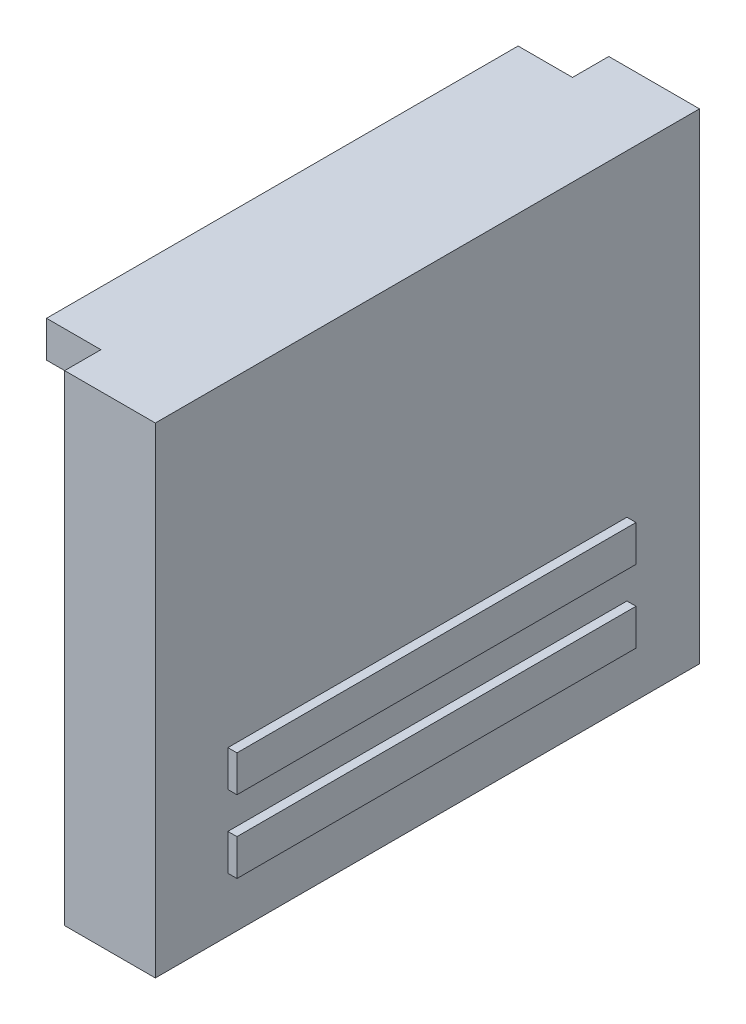
ISO-10303-21;
HEADER;
FILE_DESCRIPTION(('STEP AP214'),'2;1');
FILE_NAME('part.step','',(''),(''),'','','');
FILE_SCHEMA(('AUTOMOTIVE_DESIGN { 1 0 10303 214 1 1 1 1 }'));
ENDSEC;
DATA;
#1=APPLICATION_CONTEXT('core data for automotive mechanical design processes');
#2=APPLICATION_PROTOCOL_DEFINITION('international standard','automotive_design',2000,#1);
#3=PRODUCT_CONTEXT('',#1,'mechanical');
#4=PRODUCT('Part','Part','',(#3));
#5=PRODUCT_RELATED_PRODUCT_CATEGORY('part','',(#4));
#6=PRODUCT_DEFINITION_FORMATION('','',#4);
#7=PRODUCT_DEFINITION_CONTEXT('part definition',#1,'design');
#8=PRODUCT_DEFINITION('design','',#6,#7);
#9=PRODUCT_DEFINITION_SHAPE('','',#8);
#10=(LENGTH_UNIT() NAMED_UNIT(*) SI_UNIT(.MILLI.,.METRE.));
#11=(NAMED_UNIT(*) PLANE_ANGLE_UNIT() SI_UNIT($,.RADIAN.));
#12=(NAMED_UNIT(*) SI_UNIT($,.STERADIAN.) SOLID_ANGLE_UNIT());
#13=UNCERTAINTY_MEASURE_WITH_UNIT(LENGTH_MEASURE(1.E-05),#10,'distance_accuracy_value','');
#14=(GEOMETRIC_REPRESENTATION_CONTEXT(3) GLOBAL_UNCERTAINTY_ASSIGNED_CONTEXT((#13)) GLOBAL_UNIT_ASSIGNED_CONTEXT((#10,
#11,#12)) REPRESENTATION_CONTEXT('',''));
#15=CARTESIAN_POINT('',(0.,0.,0.));
#16=DIRECTION('',(0.,0.,1.));
#17=DIRECTION('',(1.,0.,0.));
#18=AXIS2_PLACEMENT_3D('',#15,#16,#17);
#19=CARTESIAN_POINT('',(181.650792305083,0.,0.));
#20=DIRECTION('',(1.,0.,0.));
#21=DIRECTION('',(0.,0.,-1.));
#22=AXIS2_PLACEMENT_3D('',#19,#20,#21);
#23=PLANE('',#22);
#24=DIRECTION('',(0.,0.,-1.));
#25=VECTOR('',#24,1.);
#26=CARTESIAN_POINT('',(181.650792305083,37.,164.));
#27=LINE('',#26,#25);
#28=CARTESIAN_POINT('',(181.650792305083,37.,164.));
#29=VERTEX_POINT('',#28);
#30=CARTESIAN_POINT('',(181.650792305083,37.,134.));
#31=VERTEX_POINT('',#30);
#32=EDGE_CURVE('E230',#29,#31,#27,.T.);
#33=ORIENTED_EDGE('',*,*,#32,.T.);
#34=DIRECTION('',(0.,1.,0.));
#35=VECTOR('',#34,1.);
#36=CARTESIAN_POINT('',(181.650792305083,37.,134.));
#37=LINE('',#36,#35);
#38=CARTESIAN_POINT('',(181.650792305083,63.5,134.));
#39=VERTEX_POINT('',#38);
#40=EDGE_CURVE('E233',#31,#39,#37,.T.);
#41=ORIENTED_EDGE('',*,*,#40,.T.);
#42=DIRECTION('',(0.,0.,1.));
#43=VECTOR('',#42,1.);
#44=CARTESIAN_POINT('',(181.650792305083,63.5,134.));
#45=LINE('',#44,#43);
#46=CARTESIAN_POINT('',(181.650792305083,63.5,164.));
#47=VERTEX_POINT('',#46);
#48=EDGE_CURVE('E236',#39,#47,#45,.T.);
#49=ORIENTED_EDGE('',*,*,#48,.T.);
#50=DIRECTION('',(0.,-1.,0.));
#51=VECTOR('',#50,1.);
#52=CARTESIAN_POINT('',(181.650792305083,63.5,164.));
#53=LINE('',#52,#51);
#54=EDGE_CURVE('E238',#47,#29,#53,.T.);
#55=ORIENTED_EDGE('',*,*,#54,.T.);
#56=EDGE_LOOP('',(#33,#41,#49,#55));
#57=FACE_BOUND('',#56,.T.);
#58=DIRECTION('',(0.,-1.,0.));
#59=VECTOR('',#58,1.);
#60=CARTESIAN_POINT('',(181.650792305083,0.,138.));
#61=LINE('',#60,#59);
#62=CARTESIAN_POINT('',(181.650792305083,42.,138.));
#63=VERTEX_POINT('',#62);
#64=CARTESIAN_POINT('',(181.650792305083,40.,138.));
#65=VERTEX_POINT('',#64);
#66=EDGE_CURVE('E266',#63,#65,#61,.T.);
#67=ORIENTED_EDGE('',*,*,#66,.T.);
#68=DIRECTION('',(0.,0.,1.));
#69=VECTOR('',#68,1.);
#70=CARTESIAN_POINT('',(181.650792305083,40.,0.));
#71=LINE('',#70,#69);
#72=CARTESIAN_POINT('',(181.650792305083,40.,160.));
#73=VERTEX_POINT('',#72);
#74=EDGE_CURVE('E269',#65,#73,#71,.T.);
#75=ORIENTED_EDGE('',*,*,#74,.T.);
#76=DIRECTION('',(0.,1.,0.));
#77=VECTOR('',#76,1.);
#78=CARTESIAN_POINT('',(181.650792305083,0.,160.));
#79=LINE('',#78,#77);
#80=CARTESIAN_POINT('',(181.650792305083,42.,160.));
#81=VERTEX_POINT('',#80);
#82=EDGE_CURVE('E260',#73,#81,#79,.T.);
#83=ORIENTED_EDGE('',*,*,#82,.T.);
#84=DIRECTION('',(0.,0.,-1.));
#85=VECTOR('',#84,1.);
#86=CARTESIAN_POINT('',(181.650792305083,42.,0.));
#87=LINE('',#86,#85);
#88=EDGE_CURVE('E263',#81,#63,#87,.T.);
#89=ORIENTED_EDGE('',*,*,#88,.T.);
#90=EDGE_LOOP('',(#67,#75,#83,#89));
#91=FACE_BOUND('',#90,.T.);
#92=DIRECTION('',(0.,-1.,0.));
#93=VECTOR('',#92,1.);
#94=CARTESIAN_POINT('',(181.650792305083,0.,138.));
#95=LINE('',#94,#93);
#96=CARTESIAN_POINT('',(181.650792305083,46.,138.));
#97=VERTEX_POINT('',#96);
#98=CARTESIAN_POINT('',(181.650792305083,44.,138.));
#99=VERTEX_POINT('',#98);
#100=EDGE_CURVE('E278',#97,#99,#95,.T.);
#101=ORIENTED_EDGE('',*,*,#100,.T.);
#102=DIRECTION('',(0.,0.,1.));
#103=VECTOR('',#102,1.);
#104=CARTESIAN_POINT('',(181.650792305083,44.,0.));
#105=LINE('',#104,#103);
#106=CARTESIAN_POINT('',(181.650792305083,44.,160.));
#107=VERTEX_POINT('',#106);
#108=EDGE_CURVE('E45',#99,#107,#105,.T.);
#109=ORIENTED_EDGE('',*,*,#108,.T.);
#110=DIRECTION('',(0.,1.,0.));
#111=VECTOR('',#110,1.);
#112=CARTESIAN_POINT('',(181.650792305083,0.,160.));
#113=LINE('',#112,#111);
#114=CARTESIAN_POINT('',(181.650792305083,46.,160.));
#115=VERTEX_POINT('',#114);
#116=EDGE_CURVE('E272',#107,#115,#113,.T.);
#117=ORIENTED_EDGE('',*,*,#116,.T.);
#118=DIRECTION('',(0.,0.,-1.));
#119=VECTOR('',#118,1.);
#120=CARTESIAN_POINT('',(181.650792305083,46.,0.));
#121=LINE('',#120,#119);
#122=EDGE_CURVE('E275',#115,#97,#121,.T.);
#123=ORIENTED_EDGE('',*,*,#122,.T.);
#124=EDGE_LOOP('',(#101,#109,#117,#123));
#125=FACE_BOUND('',#124,.T.);
#126=ADVANCED_FACE('F37',(#57,#91,#125),#23,.T.);
#127=CARTESIAN_POINT('',(181.650792305083,37.,164.));
#128=DIRECTION('',(0.,1.,0.));
#129=DIRECTION('',(0.,0.,1.));
#130=AXIS2_PLACEMENT_3D('',#127,#128,#129);
#131=PLANE('',#130);
#132=DIRECTION('',(0.,0.,-1.));
#133=VECTOR('',#132,1.);
#134=CARTESIAN_POINT('',(176.650792305083,37.,164.));
#135=LINE('',#134,#133);
#136=CARTESIAN_POINT('',(176.650792305083,37.,164.));
#137=VERTEX_POINT('',#136);
#138=CARTESIAN_POINT('',(176.650792305083,37.,134.));
#139=VERTEX_POINT('',#138);
#140=EDGE_CURVE('E229',#137,#139,#135,.T.);
#141=ORIENTED_EDGE('',*,*,#140,.T.);
#142=DIRECTION('',(-1.,0.,0.));
#143=VECTOR('',#142,1.);
#144=CARTESIAN_POINT('',(181.650792305083,37.,134.));
#145=LINE('',#144,#143);
#146=EDGE_CURVE('E257',#31,#139,#145,.T.);
#147=ORIENTED_EDGE('',*,*,#146,.F.);
#148=ORIENTED_EDGE('',*,*,#32,.F.);
#149=DIRECTION('',(-1.,0.,0.));
#150=VECTOR('',#149,1.);
#151=CARTESIAN_POINT('',(181.650792305083,37.,164.));
#152=LINE('',#151,#150);
#153=EDGE_CURVE('E240',#29,#137,#152,.T.);
#154=ORIENTED_EDGE('',*,*,#153,.T.);
#155=EDGE_LOOP('',(#141,#147,#148,#154));
#156=FACE_BOUND('',#155,.T.);
#157=ADVANCED_FACE('F39',(#156),#131,.F.);
#158=CARTESIAN_POINT('',(181.650792305083,37.,134.));
#159=DIRECTION('',(0.,0.,1.));
#160=DIRECTION('',(1.,0.,0.));
#161=AXIS2_PLACEMENT_3D('',#158,#159,#160);
#162=PLANE('',#161);
#163=DIRECTION('',(0.,1.,0.));
#164=VECTOR('',#163,1.);
#165=CARTESIAN_POINT('',(176.650792305083,37.,134.));
#166=LINE('',#165,#164);
#167=CARTESIAN_POINT('',(176.650792305083,63.5,134.));
#168=VERTEX_POINT('',#167);
#169=EDGE_CURVE('E243',#139,#168,#166,.T.);
#170=ORIENTED_EDGE('',*,*,#169,.T.);
#171=DIRECTION('',(-1.,0.,0.));
#172=VECTOR('',#171,1.);
#173=CARTESIAN_POINT('',(181.650792305083,63.5,134.));
#174=LINE('',#173,#172);
#175=EDGE_CURVE('E254',#39,#168,#174,.T.);
#176=ORIENTED_EDGE('',*,*,#175,.F.);
#177=ORIENTED_EDGE('',*,*,#40,.F.);
#178=ORIENTED_EDGE('',*,*,#146,.T.);
#179=EDGE_LOOP('',(#170,#176,#177,#178));
#180=FACE_BOUND('',#179,.T.);
#181=ADVANCED_FACE('F310',(#180),#162,.F.);
#182=CARTESIAN_POINT('',(181.650792305083,63.5,134.));
#183=DIRECTION('',(0.,-1.,0.));
#184=DIRECTION('',(0.,0.,-1.));
#185=AXIS2_PLACEMENT_3D('',#182,#183,#184);
#186=PLANE('',#185);
#187=DIRECTION('',(0.,0.,1.));
#188=VECTOR('',#187,1.);
#189=CARTESIAN_POINT('',(176.650792305083,63.5,134.));
#190=LINE('',#189,#188);
#191=CARTESIAN_POINT('',(176.650792305083,63.5,136.));
#192=VERTEX_POINT('',#191);
#193=EDGE_CURVE('E246',#168,#192,#190,.T.);
#194=ORIENTED_EDGE('',*,*,#193,.T.);
#195=DIRECTION('',(-1.,0.,0.));
#196=VECTOR('',#195,1.);
#197=CARTESIAN_POINT('',(176.650792305083,63.5,136.));
#198=LINE('',#197,#196);
#199=CARTESIAN_POINT('',(173.650792305083,63.5,136.));
#200=VERTEX_POINT('',#199);
#201=EDGE_CURVE('E158',#192,#200,#198,.T.);
#202=ORIENTED_EDGE('',*,*,#201,.T.);
#203=DIRECTION('',(0.,0.,1.));
#204=VECTOR('',#203,1.);
#205=CARTESIAN_POINT('',(173.650792305083,63.5,136.));
#206=LINE('',#205,#204);
#207=CARTESIAN_POINT('',(173.650792305083,63.5,162.));
#208=VERTEX_POINT('',#207);
#209=EDGE_CURVE('E175',#200,#208,#206,.T.);
#210=ORIENTED_EDGE('',*,*,#209,.T.);
#211=DIRECTION('',(-1.,0.,0.));
#212=VECTOR('',#211,1.);
#213=CARTESIAN_POINT('',(176.650792305083,63.5,162.));
#214=LINE('',#213,#212);
#215=CARTESIAN_POINT('',(176.650792305083,63.5,162.));
#216=VERTEX_POINT('',#215);
#217=EDGE_CURVE('E187',#216,#208,#214,.T.);
#218=ORIENTED_EDGE('',*,*,#217,.F.);
#219=CARTESIAN_POINT('',(176.650792305083,63.5,164.));
#220=VERTEX_POINT('',#219);
#221=EDGE_CURVE('E245',#216,#220,#190,.T.);
#222=ORIENTED_EDGE('',*,*,#221,.T.);
#223=DIRECTION('',(-1.,0.,0.));
#224=VECTOR('',#223,1.);
#225=CARTESIAN_POINT('',(181.650792305083,63.5,164.));
#226=LINE('',#225,#224);
#227=EDGE_CURVE('E251',#47,#220,#226,.T.);
#228=ORIENTED_EDGE('',*,*,#227,.F.);
#229=ORIENTED_EDGE('',*,*,#48,.F.);
#230=ORIENTED_EDGE('',*,*,#175,.T.);
#231=EDGE_LOOP('',(#194,#202,#210,#218,#222,#228,#229,#230));
#232=FACE_BOUND('',#231,.T.);
#233=ADVANCED_FACE('F323',(#232),#186,.F.);
#234=CARTESIAN_POINT('',(181.650792305083,63.5,164.));
#235=DIRECTION('',(0.,0.,-1.));
#236=DIRECTION('',(-1.,0.,0.));
#237=AXIS2_PLACEMENT_3D('',#234,#235,#236);
#238=PLANE('',#237);
#239=DIRECTION('',(0.,-1.,0.));
#240=VECTOR('',#239,1.);
#241=CARTESIAN_POINT('',(176.650792305083,63.5,164.));
#242=LINE('',#241,#240);
#243=EDGE_CURVE('E234',#220,#137,#242,.T.);
#244=ORIENTED_EDGE('',*,*,#243,.T.);
#245=ORIENTED_EDGE('',*,*,#153,.F.);
#246=ORIENTED_EDGE('',*,*,#54,.F.);
#247=ORIENTED_EDGE('',*,*,#227,.T.);
#248=EDGE_LOOP('',(#244,#245,#246,#247));
#249=FACE_BOUND('',#248,.T.);
#250=ADVANCED_FACE('F319',(#249),#238,.F.);
#251=CARTESIAN_POINT('',(176.650792305083,0.,0.));
#252=DIRECTION('',(1.,0.,0.));
#253=DIRECTION('',(0.,0.,-1.));
#254=AXIS2_PLACEMENT_3D('',#251,#252,#253);
#255=PLANE('',#254);
#256=CARTESIAN_POINT('',(176.650792305083,43.,149.));
#257=DIRECTION('',(1.,0.,0.));
#258=DIRECTION('',(0.,0.,-1.));
#259=AXIS2_PLACEMENT_3D('',#256,#257,#258);
#260=CIRCLE('',#259,2.);
#261=CARTESIAN_POINT('',(176.650792305083,43.,147.));
#262=VERTEX_POINT('',#261);
#263=EDGE_CURVE('E11',#262,#262,#260,.F.);
#264=ORIENTED_EDGE('',*,*,#263,.F.);
#265=EDGE_LOOP('',(#264));
#266=FACE_BOUND('',#265,.T.);
#267=DIRECTION('',(0.,0.,-1.));
#268=VECTOR('',#267,1.);
#269=CARTESIAN_POINT('',(176.650792305083,61.5,162.));
#270=LINE('',#269,#268);
#271=CARTESIAN_POINT('',(176.650792305083,61.5,162.));
#272=VERTEX_POINT('',#271);
#273=CARTESIAN_POINT('',(176.650792305083,61.5,136.));
#274=VERTEX_POINT('',#273);
#275=EDGE_CURVE('E52',#272,#274,#270,.T.);
#276=ORIENTED_EDGE('',*,*,#275,.T.);
#277=DIRECTION('',(0.,1.,0.));
#278=VECTOR('',#277,1.);
#279=CARTESIAN_POINT('',(176.650792305083,61.5,136.));
#280=LINE('',#279,#278);
#281=EDGE_CURVE('E153',#274,#192,#280,.T.);
#282=ORIENTED_EDGE('',*,*,#281,.T.);
#283=ORIENTED_EDGE('',*,*,#193,.F.);
#284=ORIENTED_EDGE('',*,*,#169,.F.);
#285=ORIENTED_EDGE('',*,*,#140,.F.);
#286=ORIENTED_EDGE('',*,*,#243,.F.);
#287=ORIENTED_EDGE('',*,*,#221,.F.);
#288=DIRECTION('',(0.,-1.,0.));
#289=VECTOR('',#288,1.);
#290=CARTESIAN_POINT('',(176.650792305083,63.5,162.));
#291=LINE('',#290,#289);
#292=EDGE_CURVE('E162',#216,#272,#291,.T.);
#293=ORIENTED_EDGE('',*,*,#292,.T.);
#294=EDGE_LOOP('',(#276,#282,#283,#284,#285,#286,#287,#293));
#295=FACE_BOUND('',#294,.T.);
#296=ADVANCED_FACE('F170',(#266,#295),#255,.F.);
#297=CARTESIAN_POINT('',(182.150792305083,40.,160.));
#298=DIRECTION('',(0.,1.,0.));
#299=DIRECTION('',(0.,0.,1.));
#300=AXIS2_PLACEMENT_3D('',#297,#298,#299);
#301=PLANE('',#300);
#302=ORIENTED_EDGE('',*,*,#74,.F.);
#303=DIRECTION('',(-1.,0.,0.));
#304=VECTOR('',#303,1.);
#305=CARTESIAN_POINT('',(182.150792305083,40.,138.));
#306=LINE('',#305,#304);
#307=CARTESIAN_POINT('',(182.150792305083,40.,138.));
#308=VERTEX_POINT('',#307);
#309=EDGE_CURVE('E226',#308,#65,#306,.T.);
#310=ORIENTED_EDGE('',*,*,#309,.F.);
#311=DIRECTION('',(0.,0.,-1.));
#312=VECTOR('',#311,1.);
#313=CARTESIAN_POINT('',(182.150792305083,40.,160.));
#314=LINE('',#313,#312);
#315=CARTESIAN_POINT('',(182.150792305083,40.,160.));
#316=VERTEX_POINT('',#315);
#317=EDGE_CURVE('E209',#316,#308,#314,.T.);
#318=ORIENTED_EDGE('',*,*,#317,.F.);
#319=DIRECTION('',(-1.,0.,0.));
#320=VECTOR('',#319,1.);
#321=CARTESIAN_POINT('',(182.150792305083,40.,160.));
#322=LINE('',#321,#320);
#323=EDGE_CURVE('E218',#316,#73,#322,.T.);
#324=ORIENTED_EDGE('',*,*,#323,.T.);
#325=EDGE_LOOP('',(#302,#310,#318,#324));
#326=FACE_BOUND('',#325,.T.);
#327=ADVANCED_FACE('F315',(#326),#301,.F.);
#328=CARTESIAN_POINT('',(182.150792305083,40.,138.));
#329=DIRECTION('',(0.,0.,1.));
#330=DIRECTION('',(1.,0.,0.));
#331=AXIS2_PLACEMENT_3D('',#328,#329,#330);
#332=PLANE('',#331);
#333=ORIENTED_EDGE('',*,*,#66,.F.);
#334=DIRECTION('',(-1.,0.,0.));
#335=VECTOR('',#334,1.);
#336=CARTESIAN_POINT('',(182.150792305083,42.,138.));
#337=LINE('',#336,#335);
#338=CARTESIAN_POINT('',(182.150792305083,42.,138.));
#339=VERTEX_POINT('',#338);
#340=EDGE_CURVE('E223',#339,#63,#337,.T.);
#341=ORIENTED_EDGE('',*,*,#340,.F.);
#342=DIRECTION('',(0.,1.,0.));
#343=VECTOR('',#342,1.);
#344=CARTESIAN_POINT('',(182.150792305083,40.,138.));
#345=LINE('',#344,#343);
#346=EDGE_CURVE('E212',#308,#339,#345,.T.);
#347=ORIENTED_EDGE('',*,*,#346,.F.);
#348=ORIENTED_EDGE('',*,*,#309,.T.);
#349=EDGE_LOOP('',(#333,#341,#347,#348));
#350=FACE_BOUND('',#349,.T.);
#351=ADVANCED_FACE('F494',(#350),#332,.F.);
#352=CARTESIAN_POINT('',(182.150792305083,42.,138.));
#353=DIRECTION('',(0.,-1.,0.));
#354=DIRECTION('',(0.,0.,-1.));
#355=AXIS2_PLACEMENT_3D('',#352,#353,#354);
#356=PLANE('',#355);
#357=ORIENTED_EDGE('',*,*,#88,.F.);
#358=DIRECTION('',(-1.,0.,0.));
#359=VECTOR('',#358,1.);
#360=CARTESIAN_POINT('',(182.150792305083,42.,160.));
#361=LINE('',#360,#359);
#362=CARTESIAN_POINT('',(182.150792305083,42.,160.));
#363=VERTEX_POINT('',#362);
#364=EDGE_CURVE('E221',#363,#81,#361,.T.);
#365=ORIENTED_EDGE('',*,*,#364,.F.);
#366=DIRECTION('',(0.,0.,1.));
#367=VECTOR('',#366,1.);
#368=CARTESIAN_POINT('',(182.150792305083,42.,138.));
#369=LINE('',#368,#367);
#370=EDGE_CURVE('E214',#339,#363,#369,.T.);
#371=ORIENTED_EDGE('',*,*,#370,.F.);
#372=ORIENTED_EDGE('',*,*,#340,.T.);
#373=EDGE_LOOP('',(#357,#365,#371,#372));
#374=FACE_BOUND('',#373,.T.);
#375=ADVANCED_FACE('F484',(#374),#356,.F.);
#376=CARTESIAN_POINT('',(182.150792305083,42.,160.));
#377=DIRECTION('',(0.,0.,-1.));
#378=DIRECTION('',(-1.,0.,0.));
#379=AXIS2_PLACEMENT_3D('',#376,#377,#378);
#380=PLANE('',#379);
#381=ORIENTED_EDGE('',*,*,#82,.F.);
#382=ORIENTED_EDGE('',*,*,#323,.F.);
#383=DIRECTION('',(0.,-1.,0.));
#384=VECTOR('',#383,1.);
#385=CARTESIAN_POINT('',(182.150792305083,42.,160.));
#386=LINE('',#385,#384);
#387=EDGE_CURVE('E216',#363,#316,#386,.T.);
#388=ORIENTED_EDGE('',*,*,#387,.F.);
#389=ORIENTED_EDGE('',*,*,#364,.T.);
#390=EDGE_LOOP('',(#381,#382,#388,#389));
#391=FACE_BOUND('',#390,.T.);
#392=ADVANCED_FACE('F474',(#391),#380,.F.);
#393=CARTESIAN_POINT('',(182.150792305083,0.,0.));
#394=DIRECTION('',(1.,0.,0.));
#395=DIRECTION('',(0.,0.,-1.));
#396=AXIS2_PLACEMENT_3D('',#393,#394,#395);
#397=PLANE('',#396);
#398=ORIENTED_EDGE('',*,*,#317,.T.);
#399=ORIENTED_EDGE('',*,*,#346,.T.);
#400=ORIENTED_EDGE('',*,*,#370,.T.);
#401=ORIENTED_EDGE('',*,*,#387,.T.);
#402=EDGE_LOOP('',(#398,#399,#400,#401));
#403=FACE_BOUND('',#402,.T.);
#404=ADVANCED_FACE('F365',(#403),#397,.T.);
#405=CARTESIAN_POINT('',(182.150792305083,44.,160.));
#406=DIRECTION('',(0.,1.,0.));
#407=DIRECTION('',(0.,0.,1.));
#408=AXIS2_PLACEMENT_3D('',#405,#406,#407);
#409=PLANE('',#408);
#410=ORIENTED_EDGE('',*,*,#108,.F.);
#411=DIRECTION('',(-1.,0.,0.));
#412=VECTOR('',#411,1.);
#413=CARTESIAN_POINT('',(182.150792305083,44.,138.));
#414=LINE('',#413,#412);
#415=CARTESIAN_POINT('',(182.150792305083,44.,138.));
#416=VERTEX_POINT('',#415);
#417=EDGE_CURVE('E167',#416,#99,#414,.T.);
#418=ORIENTED_EDGE('',*,*,#417,.F.);
#419=DIRECTION('',(0.,0.,-1.));
#420=VECTOR('',#419,1.);
#421=CARTESIAN_POINT('',(182.150792305083,44.,160.));
#422=LINE('',#421,#420);
#423=CARTESIAN_POINT('',(182.150792305083,44.,160.));
#424=VERTEX_POINT('',#423);
#425=EDGE_CURVE('E206',#424,#416,#422,.T.);
#426=ORIENTED_EDGE('',*,*,#425,.F.);
#427=DIRECTION('',(-1.,0.,0.));
#428=VECTOR('',#427,1.);
#429=CARTESIAN_POINT('',(182.150792305083,44.,160.));
#430=LINE('',#429,#428);
#431=EDGE_CURVE('E197',#424,#107,#430,.T.);
#432=ORIENTED_EDGE('',*,*,#431,.T.);
#433=EDGE_LOOP('',(#410,#418,#426,#432));
#434=FACE_BOUND('',#433,.T.);
#435=ADVANCED_FACE('F284',(#434),#409,.F.);
#436=CARTESIAN_POINT('',(182.150792305083,44.,138.));
#437=DIRECTION('',(0.,0.,1.));
#438=DIRECTION('',(1.,0.,0.));
#439=AXIS2_PLACEMENT_3D('',#436,#437,#438);
#440=PLANE('',#439);
#441=ORIENTED_EDGE('',*,*,#100,.F.);
#442=DIRECTION('',(-1.,0.,0.));
#443=VECTOR('',#442,1.);
#444=CARTESIAN_POINT('',(182.150792305083,46.,138.));
#445=LINE('',#444,#443);
#446=CARTESIAN_POINT('',(182.150792305083,46.,138.));
#447=VERTEX_POINT('',#446);
#448=EDGE_CURVE('E193',#447,#97,#445,.T.);
#449=ORIENTED_EDGE('',*,*,#448,.F.);
#450=DIRECTION('',(0.,1.,0.));
#451=VECTOR('',#450,1.);
#452=CARTESIAN_POINT('',(182.150792305083,44.,138.));
#453=LINE('',#452,#451);
#454=EDGE_CURVE('E204',#416,#447,#453,.T.);
#455=ORIENTED_EDGE('',*,*,#454,.F.);
#456=ORIENTED_EDGE('',*,*,#417,.T.);
#457=EDGE_LOOP('',(#441,#449,#455,#456));
#458=FACE_BOUND('',#457,.T.);
#459=ADVANCED_FACE('F288',(#458),#440,.F.);
#460=CARTESIAN_POINT('',(182.150792305083,46.,138.));
#461=DIRECTION('',(0.,-1.,0.));
#462=DIRECTION('',(0.,0.,-1.));
#463=AXIS2_PLACEMENT_3D('',#460,#461,#462);
#464=PLANE('',#463);
#465=ORIENTED_EDGE('',*,*,#122,.F.);
#466=DIRECTION('',(-1.,0.,0.));
#467=VECTOR('',#466,1.);
#468=CARTESIAN_POINT('',(182.150792305083,46.,160.));
#469=LINE('',#468,#467);
#470=CARTESIAN_POINT('',(182.150792305083,46.,160.));
#471=VERTEX_POINT('',#470);
#472=EDGE_CURVE('E60',#471,#115,#469,.T.);
#473=ORIENTED_EDGE('',*,*,#472,.F.);
#474=DIRECTION('',(0.,0.,1.));
#475=VECTOR('',#474,1.);
#476=CARTESIAN_POINT('',(182.150792305083,46.,138.));
#477=LINE('',#476,#475);
#478=EDGE_CURVE('E202',#447,#471,#477,.T.);
#479=ORIENTED_EDGE('',*,*,#478,.F.);
#480=ORIENTED_EDGE('',*,*,#448,.T.);
#481=EDGE_LOOP('',(#465,#473,#479,#480));
#482=FACE_BOUND('',#481,.T.);
#483=ADVANCED_FACE('F295',(#482),#464,.F.);
#484=CARTESIAN_POINT('',(182.150792305083,46.,160.));
#485=DIRECTION('',(0.,0.,-1.));
#486=DIRECTION('',(-1.,0.,0.));
#487=AXIS2_PLACEMENT_3D('',#484,#485,#486);
#488=PLANE('',#487);
#489=ORIENTED_EDGE('',*,*,#116,.F.);
#490=ORIENTED_EDGE('',*,*,#431,.F.);
#491=DIRECTION('',(0.,-1.,0.));
#492=VECTOR('',#491,1.);
#493=CARTESIAN_POINT('',(182.150792305083,46.,160.));
#494=LINE('',#493,#492);
#495=EDGE_CURVE('E200',#471,#424,#494,.T.);
#496=ORIENTED_EDGE('',*,*,#495,.F.);
#497=ORIENTED_EDGE('',*,*,#472,.T.);
#498=EDGE_LOOP('',(#489,#490,#496,#497));
#499=FACE_BOUND('',#498,.T.);
#500=ADVANCED_FACE('F293',(#499),#488,.F.);
#501=CARTESIAN_POINT('',(182.150792305083,0.,0.));
#502=DIRECTION('',(1.,0.,0.));
#503=DIRECTION('',(0.,0.,-1.));
#504=AXIS2_PLACEMENT_3D('',#501,#502,#503);
#505=PLANE('',#504);
#506=ORIENTED_EDGE('',*,*,#425,.T.);
#507=ORIENTED_EDGE('',*,*,#454,.T.);
#508=ORIENTED_EDGE('',*,*,#478,.T.);
#509=ORIENTED_EDGE('',*,*,#495,.T.);
#510=EDGE_LOOP('',(#506,#507,#508,#509));
#511=FACE_BOUND('',#510,.T.);
#512=ADVANCED_FACE('F292',(#511),#505,.T.);
#513=CARTESIAN_POINT('',(176.650792305083,61.5,162.));
#514=DIRECTION('',(0.,1.,0.));
#515=DIRECTION('',(0.,0.,1.));
#516=AXIS2_PLACEMENT_3D('',#513,#514,#515);
#517=PLANE('',#516);
#518=DIRECTION('',(0.,0.,-1.));
#519=VECTOR('',#518,1.);
#520=CARTESIAN_POINT('',(173.650792305083,61.5,162.));
#521=LINE('',#520,#519);
#522=CARTESIAN_POINT('',(173.650792305083,61.5,162.));
#523=VERTEX_POINT('',#522);
#524=CARTESIAN_POINT('',(173.650792305083,61.5,136.));
#525=VERTEX_POINT('',#524);
#526=EDGE_CURVE('E166',#523,#525,#521,.T.);
#527=ORIENTED_EDGE('',*,*,#526,.T.);
#528=DIRECTION('',(-1.,0.,0.));
#529=VECTOR('',#528,1.);
#530=CARTESIAN_POINT('',(176.650792305083,61.5,136.));
#531=LINE('',#530,#529);
#532=EDGE_CURVE('E155',#274,#525,#531,.T.);
#533=ORIENTED_EDGE('',*,*,#532,.F.);
#534=ORIENTED_EDGE('',*,*,#275,.F.);
#535=DIRECTION('',(-1.,0.,0.));
#536=VECTOR('',#535,1.);
#537=CARTESIAN_POINT('',(176.650792305083,61.5,162.));
#538=LINE('',#537,#536);
#539=EDGE_CURVE('E181',#272,#523,#538,.T.);
#540=ORIENTED_EDGE('',*,*,#539,.T.);
#541=EDGE_LOOP('',(#527,#533,#534,#540));
#542=FACE_BOUND('',#541,.T.);
#543=ADVANCED_FACE('F164',(#542),#517,.F.);
#544=CARTESIAN_POINT('',(176.650792305083,61.5,136.));
#545=DIRECTION('',(0.,0.,1.));
#546=DIRECTION('',(1.,0.,0.));
#547=AXIS2_PLACEMENT_3D('',#544,#545,#546);
#548=PLANE('',#547);
#549=DIRECTION('',(0.,1.,0.));
#550=VECTOR('',#549,1.);
#551=CARTESIAN_POINT('',(173.650792305083,61.5,136.));
#552=LINE('',#551,#550);
#553=EDGE_CURVE('E183',#525,#200,#552,.T.);
#554=ORIENTED_EDGE('',*,*,#553,.T.);
#555=ORIENTED_EDGE('',*,*,#201,.F.);
#556=ORIENTED_EDGE('',*,*,#281,.F.);
#557=ORIENTED_EDGE('',*,*,#532,.T.);
#558=EDGE_LOOP('',(#554,#555,#556,#557));
#559=FACE_BOUND('',#558,.T.);
#560=ADVANCED_FACE('F154',(#559),#548,.F.);
#561=CARTESIAN_POINT('',(176.650792305083,63.5,162.));
#562=DIRECTION('',(0.,0.,-1.));
#563=DIRECTION('',(-1.,0.,0.));
#564=AXIS2_PLACEMENT_3D('',#561,#562,#563);
#565=PLANE('',#564);
#566=DIRECTION('',(0.,-1.,0.));
#567=VECTOR('',#566,1.);
#568=CARTESIAN_POINT('',(173.650792305083,63.5,162.));
#569=LINE('',#568,#567);
#570=EDGE_CURVE('E173',#208,#523,#569,.T.);
#571=ORIENTED_EDGE('',*,*,#570,.T.);
#572=ORIENTED_EDGE('',*,*,#539,.F.);
#573=ORIENTED_EDGE('',*,*,#292,.F.);
#574=ORIENTED_EDGE('',*,*,#217,.T.);
#575=EDGE_LOOP('',(#571,#572,#573,#574));
#576=FACE_BOUND('',#575,.T.);
#577=ADVANCED_FACE('F343',(#576),#565,.F.);
#578=CARTESIAN_POINT('',(173.650792305083,0.,0.));
#579=DIRECTION('',(1.,0.,0.));
#580=DIRECTION('',(0.,0.,-1.));
#581=AXIS2_PLACEMENT_3D('',#578,#579,#580);
#582=PLANE('',#581);
#583=ORIENTED_EDGE('',*,*,#526,.F.);
#584=ORIENTED_EDGE('',*,*,#570,.F.);
#585=ORIENTED_EDGE('',*,*,#209,.F.);
#586=ORIENTED_EDGE('',*,*,#553,.F.);
#587=EDGE_LOOP('',(#583,#584,#585,#586));
#588=FACE_BOUND('',#587,.T.);
#589=ADVANCED_FACE('F345',(#588),#582,.F.);
#590=CARTESIAN_POINT('',(176.650792305083,43.,149.));
#591=DIRECTION('',(-1.,0.,0.));
#592=DIRECTION('',(0.,0.,1.));
#593=AXIS2_PLACEMENT_3D('',#590,#591,#592);
#594=CYLINDRICAL_SURFACE('',#593,2.);
#595=ORIENTED_EDGE('',*,*,#263,.T.);
#596=EDGE_LOOP('',(#595));
#597=FACE_BOUND('',#596,.T.);
#598=CARTESIAN_POINT('',(171.650792305083,43.,149.));
#599=DIRECTION('',(1.,0.,0.));
#600=DIRECTION('',(0.,0.,-1.));
#601=AXIS2_PLACEMENT_3D('',#598,#599,#600);
#602=CIRCLE('',#601,2.);
#603=CARTESIAN_POINT('',(171.650792305083,43.,147.));
#604=VERTEX_POINT('',#603);
#605=EDGE_CURVE('E178',#604,#604,#602,.T.);
#606=ORIENTED_EDGE('',*,*,#605,.T.);
#607=EDGE_LOOP('',(#606));
#608=FACE_BOUND('',#607,.T.);
#609=ADVANCED_FACE('F347',(#597,#608),#594,.T.);
#610=CARTESIAN_POINT('',(171.650792305083,43.,149.));
#611=DIRECTION('',(1.,0.,0.));
#612=DIRECTION('',(0.,0.,-1.));
#613=AXIS2_PLACEMENT_3D('',#610,#611,#612);
#614=PLANE('',#613);
#615=ORIENTED_EDGE('',*,*,#605,.F.);
#616=EDGE_LOOP('',(#615));
#617=FACE_BOUND('',#616,.T.);
#618=ADVANCED_FACE('F353',(#617),#614,.F.);
#619=CLOSED_SHELL('',(#126,#157,#181,#233,#250,#296,#327,#351,#375,#392,#404,#435,#459,#483,
#500,#512,#543,#560,#577,#589,#609,#618));
#620=MANIFOLD_SOLID_BREP('B2',#619);
#621=ADVANCED_BREP_SHAPE_REPRESENTATION('',(#18,#620),#14);
#622=SHAPE_DEFINITION_REPRESENTATION(#9,#621);
ENDSEC;
END-ISO-10303-21;
